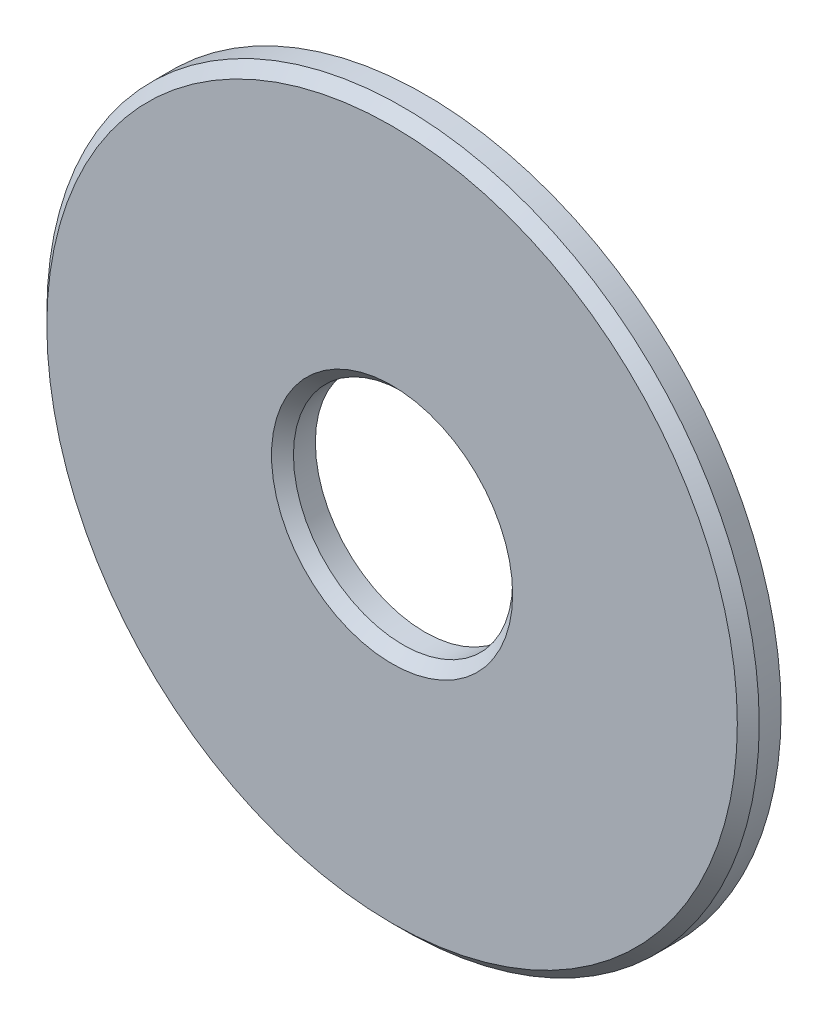
ISO-10303-21;
HEADER;
FILE_DESCRIPTION(('STEP AP214'),'2;1');
FILE_NAME('part.step','',(''),(''),'','','');
FILE_SCHEMA(('AUTOMOTIVE_DESIGN { 1 0 10303 214 1 1 1 1 }'));
ENDSEC;
DATA;
#1=APPLICATION_CONTEXT('core data for automotive mechanical design processes');
#2=APPLICATION_PROTOCOL_DEFINITION('international standard','automotive_design',2000,#1);
#3=PRODUCT_CONTEXT('',#1,'mechanical');
#4=PRODUCT('Part','Part','',(#3));
#5=PRODUCT_RELATED_PRODUCT_CATEGORY('part','',(#4));
#6=PRODUCT_DEFINITION_FORMATION('','',#4);
#7=PRODUCT_DEFINITION_CONTEXT('part definition',#1,'design');
#8=PRODUCT_DEFINITION('design','',#6,#7);
#9=PRODUCT_DEFINITION_SHAPE('','',#8);
#10=(LENGTH_UNIT() NAMED_UNIT(*) SI_UNIT(.MILLI.,.METRE.));
#11=(NAMED_UNIT(*) PLANE_ANGLE_UNIT() SI_UNIT($,.RADIAN.));
#12=(NAMED_UNIT(*) SI_UNIT($,.STERADIAN.) SOLID_ANGLE_UNIT());
#13=UNCERTAINTY_MEASURE_WITH_UNIT(LENGTH_MEASURE(1.E-05),#10,'distance_accuracy_value','');
#14=(GEOMETRIC_REPRESENTATION_CONTEXT(3) GLOBAL_UNCERTAINTY_ASSIGNED_CONTEXT((#13)) GLOBAL_UNIT_ASSIGNED_CONTEXT((#10,
#11,#12)) REPRESENTATION_CONTEXT('',''));
#15=CARTESIAN_POINT('',(0.,0.,0.));
#16=DIRECTION('',(0.,0.,1.));
#17=DIRECTION('',(1.,0.,0.));
#18=AXIS2_PLACEMENT_3D('',#15,#16,#17);
#19=CARTESIAN_POINT('',(0.,0.,6.));
#20=DIRECTION('',(0.,0.,1.));
#21=DIRECTION('',(1.,0.,0.));
#22=AXIS2_PLACEMENT_3D('',#19,#20,#21);
#23=PLANE('',#22);
#24=CARTESIAN_POINT('',(0.,0.,6.));
#25=DIRECTION('',(0.,0.,1.));
#26=DIRECTION('',(1.,0.,0.));
#27=AXIS2_PLACEMENT_3D('',#24,#25,#26);
#28=CIRCLE('',#27,22.);
#29=CARTESIAN_POINT('',(22.,0.,6.));
#30=VERTEX_POINT('',#29);
#31=EDGE_CURVE('E42',#30,#30,#28,.F.);
#32=ORIENTED_EDGE('',*,*,#31,.T.);
#33=EDGE_LOOP('',(#32));
#34=FACE_BOUND('',#33,.T.);
#35=CARTESIAN_POINT('',(0.,0.,6.));
#36=DIRECTION('',(0.,0.,1.));
#37=DIRECTION('',(1.,0.,0.));
#38=AXIS2_PLACEMENT_3D('',#35,#36,#37);
#39=CIRCLE('',#38,63.);
#40=CARTESIAN_POINT('',(63.,0.,6.));
#41=VERTEX_POINT('',#40);
#42=EDGE_CURVE('E46',#41,#41,#39,.T.);
#43=ORIENTED_EDGE('',*,*,#42,.T.);
#44=EDGE_LOOP('',(#43));
#45=FACE_BOUND('',#44,.T.);
#46=ADVANCED_FACE('F34',(#34,#45),#23,.T.);
#47=CARTESIAN_POINT('',(0.,0.,0.));
#48=DIRECTION('',(0.,0.,1.));
#49=DIRECTION('',(1.,0.,0.));
#50=AXIS2_PLACEMENT_3D('',#47,#48,#49);
#51=PLANE('',#50);
#52=CARTESIAN_POINT('',(0.,0.,0.));
#53=DIRECTION('',(0.,0.,1.));
#54=DIRECTION('',(1.,0.,0.));
#55=AXIS2_PLACEMENT_3D('',#52,#53,#54);
#56=CIRCLE('',#55,65.);
#57=CARTESIAN_POINT('',(65.,0.,0.));
#58=VERTEX_POINT('',#57);
#59=EDGE_CURVE('E55',#58,#58,#56,.T.);
#60=ORIENTED_EDGE('',*,*,#59,.F.);
#61=EDGE_LOOP('',(#60));
#62=FACE_BOUND('',#61,.T.);
#63=CARTESIAN_POINT('',(0.,0.,0.));
#64=DIRECTION('',(0.,0.,1.));
#65=DIRECTION('',(1.,0.,0.));
#66=AXIS2_PLACEMENT_3D('',#63,#64,#65);
#67=CIRCLE('',#66,20.);
#68=CARTESIAN_POINT('',(20.,0.,0.));
#69=VERTEX_POINT('',#68);
#70=EDGE_CURVE('E58',#69,#69,#67,.T.);
#71=ORIENTED_EDGE('',*,*,#70,.T.);
#72=EDGE_LOOP('',(#71));
#73=FACE_BOUND('',#72,.T.);
#74=ADVANCED_FACE('F62',(#62,#73),#51,.F.);
#75=CARTESIAN_POINT('',(0.,0.,6.));
#76=DIRECTION('',(0.,0.,-1.));
#77=DIRECTION('',(-1.,0.,0.));
#78=AXIS2_PLACEMENT_3D('',#75,#76,#77);
#79=CYLINDRICAL_SURFACE('',#78,65.);
#80=CARTESIAN_POINT('',(0.,0.,3.99999999999996));
#81=DIRECTION('',(0.,0.,1.));
#82=DIRECTION('',(1.,0.,0.));
#83=AXIS2_PLACEMENT_3D('',#80,#81,#82);
#84=CIRCLE('',#83,65.);
#85=CARTESIAN_POINT('',(65.,0.,3.99999999999996));
#86=VERTEX_POINT('',#85);
#87=EDGE_CURVE('E10',#86,#86,#84,.F.);
#88=ORIENTED_EDGE('',*,*,#87,.T.);
#89=EDGE_LOOP('',(#88));
#90=FACE_BOUND('',#89,.T.);
#91=ORIENTED_EDGE('',*,*,#59,.T.);
#92=EDGE_LOOP('',(#91));
#93=FACE_BOUND('',#92,.T.);
#94=ADVANCED_FACE('F67',(#90,#93),#79,.T.);
#95=CARTESIAN_POINT('',(0.,0.,6.));
#96=DIRECTION('',(0.,0.,-1.));
#97=DIRECTION('',(-1.,0.,0.));
#98=AXIS2_PLACEMENT_3D('',#95,#96,#97);
#99=CYLINDRICAL_SURFACE('',#98,20.);
#100=CARTESIAN_POINT('',(0.,0.,4.00000000000005));
#101=DIRECTION('',(0.,0.,1.));
#102=DIRECTION('',(1.,0.,0.));
#103=AXIS2_PLACEMENT_3D('',#100,#101,#102);
#104=CIRCLE('',#103,20.);
#105=CARTESIAN_POINT('',(20.,0.,4.00000000000005));
#106=VERTEX_POINT('',#105);
#107=EDGE_CURVE('E50',#106,#106,#104,.T.);
#108=ORIENTED_EDGE('',*,*,#107,.T.);
#109=EDGE_LOOP('',(#108));
#110=FACE_BOUND('',#109,.T.);
#111=ORIENTED_EDGE('',*,*,#70,.F.);
#112=EDGE_LOOP('',(#111));
#113=FACE_BOUND('',#112,.T.);
#114=ADVANCED_FACE('F64',(#110,#113),#99,.F.);
#115=CARTESIAN_POINT('',(0.,0.,4.00000000000005));
#116=DIRECTION('',(0.,0.,1.));
#117=DIRECTION('',(1.,0.,0.));
#118=AXIS2_PLACEMENT_3D('',#115,#116,#117);
#119=CONICAL_SURFACE('',#118,20.,0.785398163397452);
#120=ORIENTED_EDGE('',*,*,#31,.F.);
#121=EDGE_LOOP('',(#120));
#122=FACE_BOUND('',#121,.T.);
#123=ORIENTED_EDGE('',*,*,#107,.F.);
#124=EDGE_LOOP('',(#123));
#125=FACE_BOUND('',#124,.T.);
#126=ADVANCED_FACE('F66',(#122,#125),#119,.F.);
#127=CARTESIAN_POINT('',(0.,0.,6.));
#128=DIRECTION('',(0.,0.,-1.));
#129=DIRECTION('',(-1.,0.,0.));
#130=AXIS2_PLACEMENT_3D('',#127,#128,#129);
#131=CONICAL_SURFACE('',#130,63.,0.785398163397438);
#132=ORIENTED_EDGE('',*,*,#87,.F.);
#133=EDGE_LOOP('',(#132));
#134=FACE_BOUND('',#133,.T.);
#135=ORIENTED_EDGE('',*,*,#42,.F.);
#136=EDGE_LOOP('',(#135));
#137=FACE_BOUND('',#136,.T.);
#138=ADVANCED_FACE('F37',(#134,#137),#131,.T.);
#139=CLOSED_SHELL('',(#46,#74,#94,#114,#126,#138));
#140=MANIFOLD_SOLID_BREP('B2',#139);
#141=ADVANCED_BREP_SHAPE_REPRESENTATION('',(#18,#140),#14);
#142=SHAPE_DEFINITION_REPRESENTATION(#9,#141);
ENDSEC;
END-ISO-10303-21;
